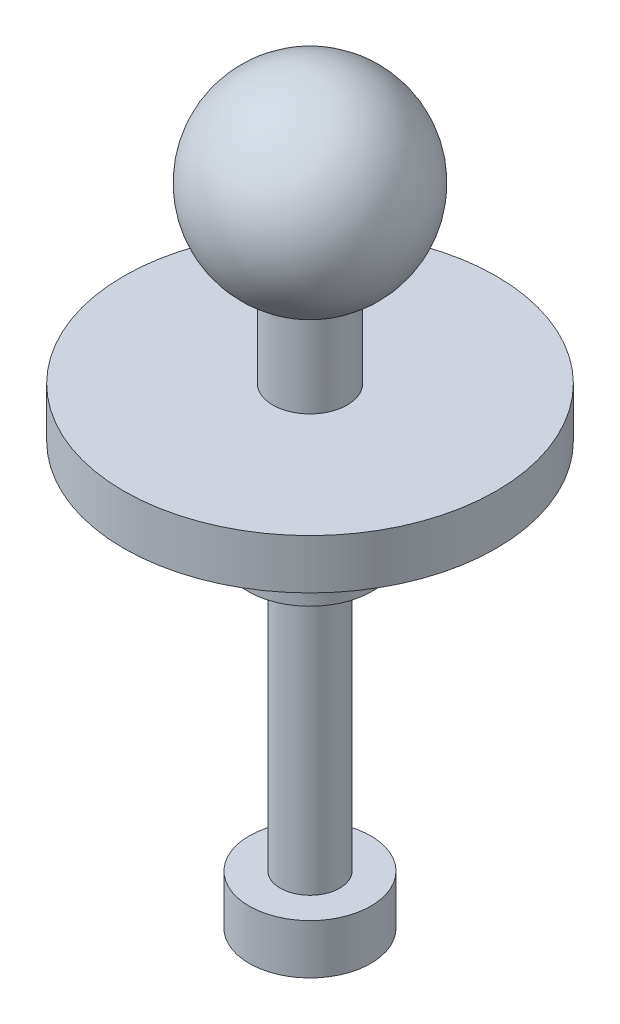
ISO-10303-21;
HEADER;
FILE_DESCRIPTION(('STEP AP214'),'2;1');
FILE_NAME('part.step','',(''),(''),'','','');
FILE_SCHEMA(('AUTOMOTIVE_DESIGN { 1 0 10303 214 1 1 1 1 }'));
ENDSEC;
DATA;
#1=APPLICATION_CONTEXT('core data for automotive mechanical design processes');
#2=APPLICATION_PROTOCOL_DEFINITION('international standard','automotive_design',2000,#1);
#3=PRODUCT_CONTEXT('',#1,'mechanical');
#4=PRODUCT('Part','Part','',(#3));
#5=PRODUCT_RELATED_PRODUCT_CATEGORY('part','',(#4));
#6=PRODUCT_DEFINITION_FORMATION('','',#4);
#7=PRODUCT_DEFINITION_CONTEXT('part definition',#1,'design');
#8=PRODUCT_DEFINITION('design','',#6,#7);
#9=PRODUCT_DEFINITION_SHAPE('','',#8);
#10=(LENGTH_UNIT() NAMED_UNIT(*) SI_UNIT(.MILLI.,.METRE.));
#11=(NAMED_UNIT(*) PLANE_ANGLE_UNIT() SI_UNIT($,.RADIAN.));
#12=(NAMED_UNIT(*) SI_UNIT($,.STERADIAN.) SOLID_ANGLE_UNIT());
#13=UNCERTAINTY_MEASURE_WITH_UNIT(LENGTH_MEASURE(1.E-05),#10,'distance_accuracy_value','');
#14=(GEOMETRIC_REPRESENTATION_CONTEXT(3) GLOBAL_UNCERTAINTY_ASSIGNED_CONTEXT((#13)) GLOBAL_UNIT_ASSIGNED_CONTEXT((#10,
#11,#12)) REPRESENTATION_CONTEXT('',''));
#15=CARTESIAN_POINT('',(0.,0.,0.));
#16=DIRECTION('',(0.,0.,1.));
#17=DIRECTION('',(1.,0.,0.));
#18=AXIS2_PLACEMENT_3D('',#15,#16,#17);
#19=CARTESIAN_POINT('',(0.,-2.,0.));
#20=DIRECTION('',(0.,1.,0.));
#21=DIRECTION('',(0.,0.,1.));
#22=AXIS2_PLACEMENT_3D('',#19,#20,#21);
#23=CYLINDRICAL_SURFACE('',#22,7.5);
#24=CARTESIAN_POINT('',(0.,-2.,0.));
#25=DIRECTION('',(0.,1.,0.));
#26=DIRECTION('',(0.,0.,1.));
#27=AXIS2_PLACEMENT_3D('',#24,#25,#26);
#28=CIRCLE('',#27,7.5);
#29=CARTESIAN_POINT('',(0.,-2.,7.5));
#30=VERTEX_POINT('',#29);
#31=EDGE_CURVE('E53',#30,#30,#28,.T.);
#32=ORIENTED_EDGE('',*,*,#31,.T.);
#33=EDGE_LOOP('',(#32));
#34=FACE_BOUND('',#33,.T.);
#35=CARTESIAN_POINT('',(0.,0.,0.));
#36=DIRECTION('',(0.,1.,0.));
#37=DIRECTION('',(0.,0.,1.));
#38=AXIS2_PLACEMENT_3D('',#35,#36,#37);
#39=CIRCLE('',#38,7.5);
#40=CARTESIAN_POINT('',(0.,0.,7.5));
#41=VERTEX_POINT('',#40);
#42=EDGE_CURVE('E48',#41,#41,#39,.T.);
#43=ORIENTED_EDGE('',*,*,#42,.F.);
#44=EDGE_LOOP('',(#43));
#45=FACE_BOUND('',#44,.T.);
#46=ADVANCED_FACE('F45',(#34,#45),#23,.T.);
#47=CARTESIAN_POINT('',(0.,-2.,0.));
#48=DIRECTION('',(0.,1.,0.));
#49=DIRECTION('',(0.,0.,1.));
#50=AXIS2_PLACEMENT_3D('',#47,#48,#49);
#51=PLANE('',#50);
#52=CARTESIAN_POINT('',(0.,-2.,0.));
#53=DIRECTION('',(0.,1.,0.));
#54=DIRECTION('',(-1.,0.,0.));
#55=AXIS2_PLACEMENT_3D('',#52,#53,#54);
#56=CIRCLE('',#55,4.);
#57=CARTESIAN_POINT('',(-4.,-2.,0.));
#58=VERTEX_POINT('',#57);
#59=EDGE_CURVE('E96',#58,#58,#56,.T.);
#60=ORIENTED_EDGE('',*,*,#59,.T.);
#61=EDGE_LOOP('',(#60));
#62=FACE_BOUND('',#61,.T.);
#63=ORIENTED_EDGE('',*,*,#31,.F.);
#64=EDGE_LOOP('',(#63));
#65=FACE_BOUND('',#64,.T.);
#66=ADVANCED_FACE('F108',(#62,#65),#51,.F.);
#67=CARTESIAN_POINT('',(0.,0.,0.));
#68=DIRECTION('',(0.,1.,0.));
#69=DIRECTION('',(0.,0.,1.));
#70=AXIS2_PLACEMENT_3D('',#67,#68,#69);
#71=PLANE('',#70);
#72=CARTESIAN_POINT('',(0.,0.,0.));
#73=DIRECTION('',(0.,1.,0.));
#74=DIRECTION('',(0.,0.,1.));
#75=AXIS2_PLACEMENT_3D('',#72,#73,#74);
#76=CIRCLE('',#75,1.5);
#77=CARTESIAN_POINT('',(0.,0.,1.5));
#78=VERTEX_POINT('',#77);
#79=EDGE_CURVE('E10',#78,#78,#76,.T.);
#80=ORIENTED_EDGE('',*,*,#79,.F.);
#81=EDGE_LOOP('',(#80));
#82=FACE_BOUND('',#81,.T.);
#83=ORIENTED_EDGE('',*,*,#42,.T.);
#84=EDGE_LOOP('',(#83));
#85=FACE_BOUND('',#84,.T.);
#86=ADVANCED_FACE('F105',(#82,#85),#71,.T.);
#87=CARTESIAN_POINT('',(0.,-4.,0.));
#88=DIRECTION('',(0.,1.,0.));
#89=DIRECTION('',(-1.,0.,0.));
#90=AXIS2_PLACEMENT_3D('',#87,#88,#89);
#91=CONICAL_SURFACE('',#90,1.2,0.950546840812076);
#92=CARTESIAN_POINT('',(0.,-4.,0.));
#93=DIRECTION('',(0.,1.,0.));
#94=DIRECTION('',(-1.,0.,0.));
#95=AXIS2_PLACEMENT_3D('',#92,#93,#94);
#96=CIRCLE('',#95,1.2);
#97=CARTESIAN_POINT('',(-1.2,-4.,0.));
#98=VERTEX_POINT('',#97);
#99=EDGE_CURVE('E92',#98,#98,#96,.T.);
#100=CARTESIAN_POINT('',(-4.,-2.,0.));
#101=CARTESIAN_POINT('',(-3.97083333333333,-2.02083333333333,0.));
#102=CARTESIAN_POINT('',(-3.94166666666667,-2.04166666666667,0.));
#103=CARTESIAN_POINT('',(-3.88333333333333,-2.08333333333334,0.));
#104=CARTESIAN_POINT('',(-3.85416666666667,-2.10416666666667,0.));
#105=CARTESIAN_POINT('',(-3.79583333333333,-2.14583333333334,0.));
#106=CARTESIAN_POINT('',(-3.76666666666667,-2.16666666666667,0.));
#107=CARTESIAN_POINT('',(-3.70833333333333,-2.20833333333334,0.));
#108=CARTESIAN_POINT('',(-3.67916666666667,-2.22916666666667,0.));
#109=CARTESIAN_POINT('',(-3.62083333333333,-2.27083333333334,0.));
#110=CARTESIAN_POINT('',(-3.59166666666667,-2.29166666666667,0.));
#111=CARTESIAN_POINT('',(-3.53333333333333,-2.33333333333333,0.));
#112=CARTESIAN_POINT('',(-3.50416666666667,-2.35416666666667,0.));
#113=CARTESIAN_POINT('',(-3.44583333333333,-2.39583333333333,0.));
#114=CARTESIAN_POINT('',(-3.41666666666667,-2.41666666666667,0.));
#115=CARTESIAN_POINT('',(-3.35833333333333,-2.45833333333333,0.));
#116=CARTESIAN_POINT('',(-3.32916666666667,-2.47916666666667,0.));
#117=CARTESIAN_POINT('',(-3.27083333333333,-2.52083333333333,0.));
#118=CARTESIAN_POINT('',(-3.24166666666667,-2.54166666666667,0.));
#119=CARTESIAN_POINT('',(-3.18333333333333,-2.58333333333333,0.));
#120=CARTESIAN_POINT('',(-3.15416666666667,-2.60416666666667,0.));
#121=CARTESIAN_POINT('',(-3.09583333333333,-2.64583333333333,0.));
#122=CARTESIAN_POINT('',(-3.06666666666667,-2.66666666666667,0.));
#123=CARTESIAN_POINT('',(-3.00833333333333,-2.70833333333333,0.));
#124=CARTESIAN_POINT('',(-2.97916666666667,-2.72916666666667,0.));
#125=CARTESIAN_POINT('',(-2.92083333333333,-2.77083333333333,0.));
#126=CARTESIAN_POINT('',(-2.89166666666667,-2.79166666666667,0.));
#127=CARTESIAN_POINT('',(-2.83333333333333,-2.83333333333333,0.));
#128=CARTESIAN_POINT('',(-2.80416666666667,-2.85416666666667,0.));
#129=CARTESIAN_POINT('',(-2.74583333333333,-2.89583333333333,0.));
#130=CARTESIAN_POINT('',(-2.71666666666667,-2.91666666666667,0.));
#131=CARTESIAN_POINT('',(-2.65833333333333,-2.95833333333333,0.));
#132=CARTESIAN_POINT('',(-2.62916666666667,-2.97916666666667,0.));
#133=CARTESIAN_POINT('',(-2.57083333333333,-3.02083333333333,0.));
#134=CARTESIAN_POINT('',(-2.54166666666667,-3.04166666666667,0.));
#135=CARTESIAN_POINT('',(-2.48333333333333,-3.08333333333333,0.));
#136=CARTESIAN_POINT('',(-2.45416666666667,-3.10416666666667,0.));
#137=CARTESIAN_POINT('',(-2.39583333333333,-3.14583333333333,0.));
#138=CARTESIAN_POINT('',(-2.36666666666667,-3.16666666666667,0.));
#139=CARTESIAN_POINT('',(-2.30833333333333,-3.20833333333333,0.));
#140=CARTESIAN_POINT('',(-2.27916666666667,-3.22916666666667,0.));
#141=CARTESIAN_POINT('',(-2.22083333333333,-3.27083333333333,0.));
#142=CARTESIAN_POINT('',(-2.19166666666667,-3.29166666666667,0.));
#143=CARTESIAN_POINT('',(-2.13333333333333,-3.33333333333333,0.));
#144=CARTESIAN_POINT('',(-2.10416666666667,-3.35416666666667,0.));
#145=CARTESIAN_POINT('',(-2.04583333333333,-3.39583333333333,0.));
#146=CARTESIAN_POINT('',(-2.01666666666667,-3.41666666666667,0.));
#147=CARTESIAN_POINT('',(-1.95833333333333,-3.45833333333333,0.));
#148=CARTESIAN_POINT('',(-1.92916666666667,-3.47916666666667,0.));
#149=CARTESIAN_POINT('',(-1.87083333333333,-3.52083333333333,0.));
#150=CARTESIAN_POINT('',(-1.84166666666667,-3.54166666666667,0.));
#151=CARTESIAN_POINT('',(-1.78333333333333,-3.58333333333333,0.));
#152=CARTESIAN_POINT('',(-1.75416666666667,-3.60416666666667,0.));
#153=CARTESIAN_POINT('',(-1.69583333333333,-3.64583333333333,0.));
#154=CARTESIAN_POINT('',(-1.66666666666667,-3.66666666666667,0.));
#155=CARTESIAN_POINT('',(-1.60833333333333,-3.70833333333333,0.));
#156=CARTESIAN_POINT('',(-1.57916666666667,-3.72916666666667,0.));
#157=CARTESIAN_POINT('',(-1.52083333333333,-3.77083333333333,0.));
#158=CARTESIAN_POINT('',(-1.49166666666667,-3.79166666666667,0.));
#159=CARTESIAN_POINT('',(-1.43333333333333,-3.83333333333333,0.));
#160=CARTESIAN_POINT('',(-1.40416666666667,-3.85416666666667,0.));
#161=CARTESIAN_POINT('',(-1.34583333333333,-3.89583333333333,0.));
#162=CARTESIAN_POINT('',(-1.31666666666667,-3.91666666666667,0.));
#163=CARTESIAN_POINT('',(-1.25833333333333,-3.95833333333333,0.));
#164=CARTESIAN_POINT('',(-1.22916666666667,-3.97916666666667,0.));
#165=CARTESIAN_POINT('',(-1.2,-4.,0.));
#166=B_SPLINE_CURVE_WITH_KNOTS('',3,(#100,#101,#102,#103,#104,#105,#106,#107,#108,#109,#110,
#111,#112,#113,#114,#115,#116,#117,#118,#119,#120,#121,#122,#123,#124,#125,#126,#127,#128,#129,
#130,#131,#132,#133,#134,#135,#136,#137,#138,#139,#140,#141,#142,#143,#144,#145,#146,#147,#148,
#149,#150,#151,#152,#153,#154,#155,#156,#157,#158,#159,#160,#161,#162,#163,#164,#165),
.UNSPECIFIED.,.F.,.F.,(4,2,2,2,2,2,2,2,2,2,2,2,2,2,2,2,2,2,2,2,2,2,2,2,2,2,2,2,2,2,2,2,4),(0.,
0.107529065838033,0.215058131676066,0.322587197514099,0.430116263352132,0.537645329190165,
0.645174395028197,0.75270346086623,0.860232526704263,0.967761592542296,1.07529065838033,
1.18281972421836,1.29034879005639,1.39787785589443,1.50540692173246,1.61293598757049,
1.72046505340853,1.82799411924656,1.93552318508459,2.04305225092262,2.15058131676066,
2.25811038259869,2.36563944843672,2.47316851427476,2.58069758011279,2.68822664595082,
2.79575571178885,2.90328477762689,3.01081384346492,3.11834290930295,3.22587197514099,
3.33340104097902,3.44093010681705),.UNSPECIFIED.);
#167=EDGE_CURVE('BSEAM120',#58,#98,#166,.T.);
#168=ORIENTED_EDGE('',*,*,#59,.F.);
#169=ORIENTED_EDGE('',*,*,#99,.T.);
#170=ORIENTED_EDGE('',*,*,#167,.T.);
#171=ORIENTED_EDGE('',*,*,#167,.F.);
#172=EDGE_LOOP('',(#168,#170,#169,#171));
#173=FACE_BOUND('',#172,.T.);
#174=ADVANCED_FACE('F120',(#173),#91,.T.);
#175=CARTESIAN_POINT('',(0.,-2.,0.));
#176=DIRECTION('',(0.,1.,0.));
#177=DIRECTION('',(-1.,0.,0.));
#178=AXIS2_PLACEMENT_3D('',#175,#176,#177);
#179=CYLINDRICAL_SURFACE('',#178,1.2);
#180=ORIENTED_EDGE('',*,*,#99,.F.);
#181=EDGE_LOOP('',(#180));
#182=FACE_BOUND('',#181,.T.);
#183=CARTESIAN_POINT('',(0.,-4.5,0.));
#184=DIRECTION('',(0.,1.,0.));
#185=DIRECTION('',(-1.,0.,0.));
#186=AXIS2_PLACEMENT_3D('',#183,#184,#185);
#187=CIRCLE('',#186,1.2);
#188=CARTESIAN_POINT('',(-1.2,-4.5,0.));
#189=VERTEX_POINT('',#188);
#190=EDGE_CURVE('E88',#189,#189,#187,.T.);
#191=ORIENTED_EDGE('',*,*,#190,.T.);
#192=EDGE_LOOP('',(#191));
#193=FACE_BOUND('',#192,.T.);
#194=ADVANCED_FACE('F124',(#182,#193),#179,.T.);
#195=CARTESIAN_POINT('',(0.,-4.5,0.));
#196=DIRECTION('',(0.,-1.,0.));
#197=DIRECTION('',(1.,0.,0.));
#198=AXIS2_PLACEMENT_3D('',#195,#196,#197);
#199=PLANE('',#198);
#200=ORIENTED_EDGE('',*,*,#190,.F.);
#201=EDGE_LOOP('',(#200));
#202=FACE_BOUND('',#201,.T.);
#203=CARTESIAN_POINT('',(0.,-4.5,0.));
#204=DIRECTION('',(0.,1.,0.));
#205=DIRECTION('',(-1.,0.,0.));
#206=AXIS2_PLACEMENT_3D('',#203,#204,#205);
#207=CIRCLE('',#206,2.5);
#208=CARTESIAN_POINT('',(-2.5,-4.5,0.));
#209=VERTEX_POINT('',#208);
#210=EDGE_CURVE('E84',#209,#209,#207,.T.);
#211=ORIENTED_EDGE('',*,*,#210,.T.);
#212=EDGE_LOOP('',(#211));
#213=FACE_BOUND('',#212,.T.);
#214=ADVANCED_FACE('F128',(#202,#213),#199,.F.);
#215=CARTESIAN_POINT('',(0.,-2.,0.));
#216=DIRECTION('',(0.,1.,0.));
#217=DIRECTION('',(-1.,0.,0.));
#218=AXIS2_PLACEMENT_3D('',#215,#216,#217);
#219=CYLINDRICAL_SURFACE('',#218,2.5);
#220=ORIENTED_EDGE('',*,*,#210,.F.);
#221=EDGE_LOOP('',(#220));
#222=FACE_BOUND('',#221,.T.);
#223=CARTESIAN_POINT('',(0.,-6.,0.));
#224=DIRECTION('',(0.,1.,0.));
#225=DIRECTION('',(-1.,0.,0.));
#226=AXIS2_PLACEMENT_3D('',#223,#224,#225);
#227=CIRCLE('',#226,2.5);
#228=CARTESIAN_POINT('',(-2.5,-6.,0.));
#229=VERTEX_POINT('',#228);
#230=EDGE_CURVE('E80',#229,#229,#227,.T.);
#231=ORIENTED_EDGE('',*,*,#230,.T.);
#232=EDGE_LOOP('',(#231));
#233=FACE_BOUND('',#232,.T.);
#234=ADVANCED_FACE('F132',(#222,#233),#219,.T.);
#235=CARTESIAN_POINT('',(0.,-6.,0.));
#236=DIRECTION('',(0.,1.,0.));
#237=DIRECTION('',(-1.,0.,0.));
#238=AXIS2_PLACEMENT_3D('',#235,#236,#237);
#239=PLANE('',#238);
#240=ORIENTED_EDGE('',*,*,#230,.F.);
#241=EDGE_LOOP('',(#240));
#242=FACE_BOUND('',#241,.T.);
#243=CARTESIAN_POINT('',(0.,-6.,0.));
#244=DIRECTION('',(0.,1.,0.));
#245=DIRECTION('',(-1.,0.,0.));
#246=AXIS2_PLACEMENT_3D('',#243,#244,#245);
#247=CIRCLE('',#246,1.2);
#248=CARTESIAN_POINT('',(-1.2,-6.,0.));
#249=VERTEX_POINT('',#248);
#250=EDGE_CURVE('E76',#249,#249,#247,.T.);
#251=ORIENTED_EDGE('',*,*,#250,.T.);
#252=EDGE_LOOP('',(#251));
#253=FACE_BOUND('',#252,.T.);
#254=ADVANCED_FACE('F136',(#242,#253),#239,.F.);
#255=CARTESIAN_POINT('',(0.,-2.,0.));
#256=DIRECTION('',(0.,1.,0.));
#257=DIRECTION('',(-1.,0.,0.));
#258=AXIS2_PLACEMENT_3D('',#255,#256,#257);
#259=CYLINDRICAL_SURFACE('',#258,1.2);
#260=ORIENTED_EDGE('',*,*,#250,.F.);
#261=EDGE_LOOP('',(#260));
#262=FACE_BOUND('',#261,.T.);
#263=CARTESIAN_POINT('',(0.,-17.,0.));
#264=DIRECTION('',(0.,1.,0.));
#265=DIRECTION('',(-1.,0.,0.));
#266=AXIS2_PLACEMENT_3D('',#263,#264,#265);
#267=CIRCLE('',#266,1.2);
#268=CARTESIAN_POINT('',(-1.2,-17.,0.));
#269=VERTEX_POINT('',#268);
#270=EDGE_CURVE('E72',#269,#269,#267,.T.);
#271=ORIENTED_EDGE('',*,*,#270,.T.);
#272=EDGE_LOOP('',(#271));
#273=FACE_BOUND('',#272,.T.);
#274=ADVANCED_FACE('F140',(#262,#273),#259,.T.);
#275=CARTESIAN_POINT('',(0.,-17.,0.));
#276=DIRECTION('',(0.,-1.,0.));
#277=DIRECTION('',(1.,0.,0.));
#278=AXIS2_PLACEMENT_3D('',#275,#276,#277);
#279=PLANE('',#278);
#280=ORIENTED_EDGE('',*,*,#270,.F.);
#281=EDGE_LOOP('',(#280));
#282=FACE_BOUND('',#281,.T.);
#283=CARTESIAN_POINT('',(0.,-17.,0.));
#284=DIRECTION('',(0.,1.,0.));
#285=DIRECTION('',(-1.,0.,0.));
#286=AXIS2_PLACEMENT_3D('',#283,#284,#285);
#287=CIRCLE('',#286,2.45);
#288=CARTESIAN_POINT('',(-2.45,-17.,0.));
#289=VERTEX_POINT('',#288);
#290=EDGE_CURVE('E68',#289,#289,#287,.T.);
#291=ORIENTED_EDGE('',*,*,#290,.T.);
#292=EDGE_LOOP('',(#291));
#293=FACE_BOUND('',#292,.T.);
#294=ADVANCED_FACE('F144',(#282,#293),#279,.F.);
#295=CARTESIAN_POINT('',(0.,-2.,0.));
#296=DIRECTION('',(0.,1.,0.));
#297=DIRECTION('',(-1.,0.,0.));
#298=AXIS2_PLACEMENT_3D('',#295,#296,#297);
#299=CYLINDRICAL_SURFACE('',#298,2.45);
#300=ORIENTED_EDGE('',*,*,#290,.F.);
#301=EDGE_LOOP('',(#300));
#302=FACE_BOUND('',#301,.T.);
#303=CARTESIAN_POINT('',(0.,-19.,0.));
#304=DIRECTION('',(0.,1.,0.));
#305=DIRECTION('',(-1.,0.,0.));
#306=AXIS2_PLACEMENT_3D('',#303,#304,#305);
#307=CIRCLE('',#306,2.45);
#308=CARTESIAN_POINT('',(-2.45,-19.,0.));
#309=VERTEX_POINT('',#308);
#310=EDGE_CURVE('E64',#309,#309,#307,.T.);
#311=ORIENTED_EDGE('',*,*,#310,.T.);
#312=EDGE_LOOP('',(#311));
#313=FACE_BOUND('',#312,.T.);
#314=ADVANCED_FACE('F148',(#302,#313),#299,.T.);
#315=CARTESIAN_POINT('',(0.,-19.,0.));
#316=DIRECTION('',(0.,1.,0.));
#317=DIRECTION('',(-1.,0.,0.));
#318=AXIS2_PLACEMENT_3D('',#315,#316,#317);
#319=PLANE('',#318);
#320=ORIENTED_EDGE('',*,*,#310,.F.);
#321=EDGE_LOOP('',(#320));
#322=FACE_BOUND('',#321,.T.);
#323=ADVANCED_FACE('F152',(#322),#319,.F.);
#324=CARTESIAN_POINT('',(0.,7.,0.));
#325=DIRECTION('',(0.,1.,0.));
#326=DIRECTION('',(0.,0.,-1.));
#327=AXIS2_PLACEMENT_3D('',#324,#325,#326);
#328=SPHERICAL_SURFACE('',#327,3.9);
#329=CARTESIAN_POINT('',(0.,3.4,0.));
#330=DIRECTION('',(0.,1.,0.));
#331=DIRECTION('',(0.,0.,1.));
#332=AXIS2_PLACEMENT_3D('',#329,#330,#331);
#333=CIRCLE('',#332,1.5);
#334=CARTESIAN_POINT('',(0.,3.4,1.5));
#335=VERTEX_POINT('',#334);
#336=EDGE_CURVE('E60',#335,#335,#333,.T.);
#337=ORIENTED_EDGE('',*,*,#336,.T.);
#338=EDGE_LOOP('',(#337));
#339=FACE_BOUND('',#338,.T.);
#340=ADVANCED_FACE('F156',(#339),#328,.T.);
#341=CARTESIAN_POINT('',(0.,10.9,0.));
#342=DIRECTION('',(0.,1.,0.));
#343=DIRECTION('',(0.,0.,1.));
#344=AXIS2_PLACEMENT_3D('',#341,#342,#343);
#345=CYLINDRICAL_SURFACE('',#344,1.5);
#346=ORIENTED_EDGE('',*,*,#79,.T.);
#347=EDGE_LOOP('',(#346));
#348=FACE_BOUND('',#347,.T.);
#349=ORIENTED_EDGE('',*,*,#336,.F.);
#350=EDGE_LOOP('',(#349));
#351=FACE_BOUND('',#350,.T.);
#352=ADVANCED_FACE('F160',(#348,#351),#345,.T.);
#353=CLOSED_SHELL('',(#46,#66,#86,#174,#194,#214,#234,#254,#274,#294,#314,#323,#340,#352));
#354=MANIFOLD_SOLID_BREP('B2',#353);
#355=ADVANCED_BREP_SHAPE_REPRESENTATION('',(#18,#354),#14);
#356=SHAPE_DEFINITION_REPRESENTATION(#9,#355);
ENDSEC;
END-ISO-10303-21;
